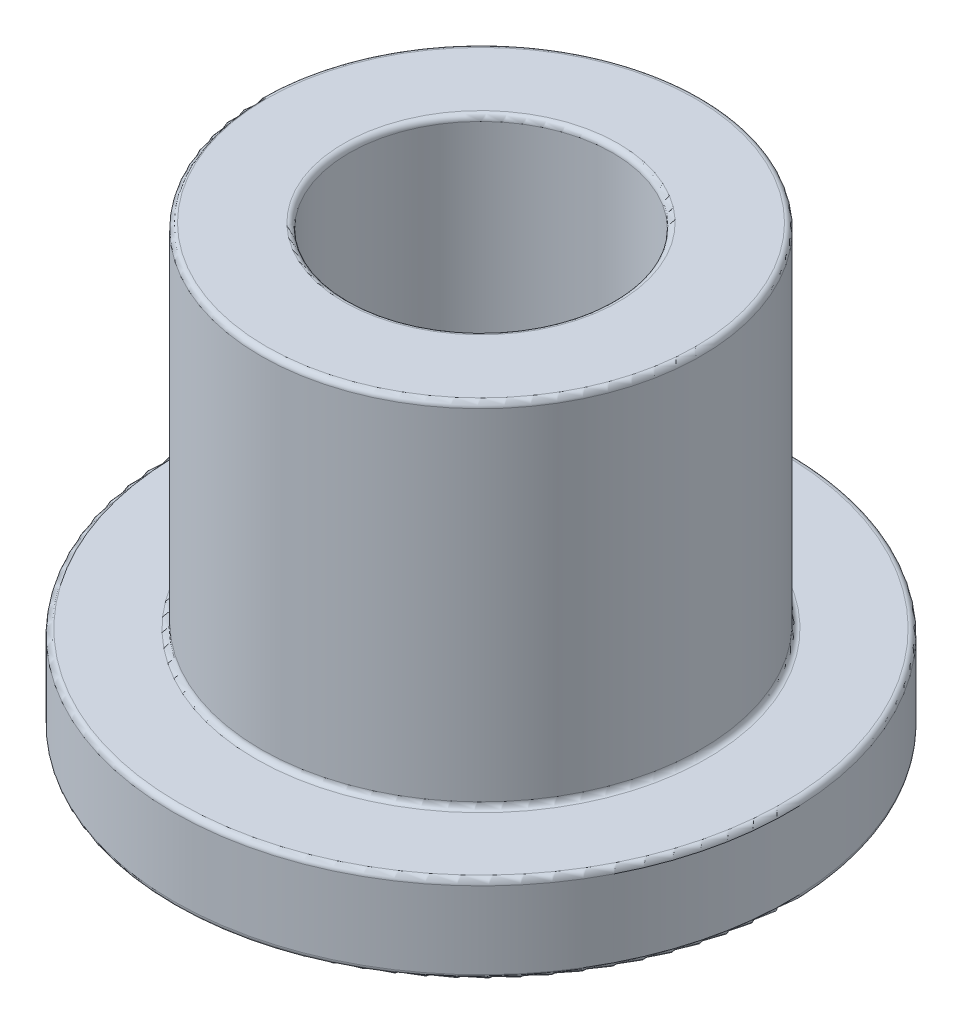
ISO-10303-21;
HEADER;
FILE_DESCRIPTION(('STEP AP214'),'2;1');
FILE_NAME('part.step','',(''),(''),'','','');
FILE_SCHEMA(('AUTOMOTIVE_DESIGN { 1 0 10303 214 1 1 1 1 }'));
ENDSEC;
DATA;
#1=APPLICATION_CONTEXT('core data for automotive mechanical design processes');
#2=APPLICATION_PROTOCOL_DEFINITION('international standard','automotive_design',2000,#1);
#3=PRODUCT_CONTEXT('',#1,'mechanical');
#4=PRODUCT('Part','Part','',(#3));
#5=PRODUCT_RELATED_PRODUCT_CATEGORY('part','',(#4));
#6=PRODUCT_DEFINITION_FORMATION('','',#4);
#7=PRODUCT_DEFINITION_CONTEXT('part definition',#1,'design');
#8=PRODUCT_DEFINITION('design','',#6,#7);
#9=PRODUCT_DEFINITION_SHAPE('','',#8);
#10=(LENGTH_UNIT() NAMED_UNIT(*) SI_UNIT(.MILLI.,.METRE.));
#11=(NAMED_UNIT(*) PLANE_ANGLE_UNIT() SI_UNIT($,.RADIAN.));
#12=(NAMED_UNIT(*) SI_UNIT($,.STERADIAN.) SOLID_ANGLE_UNIT());
#13=UNCERTAINTY_MEASURE_WITH_UNIT(LENGTH_MEASURE(1.E-05),#10,'distance_accuracy_value','');
#14=(GEOMETRIC_REPRESENTATION_CONTEXT(3) GLOBAL_UNCERTAINTY_ASSIGNED_CONTEXT((#13)) GLOBAL_UNIT_ASSIGNED_CONTEXT((#10,
#11,#12)) REPRESENTATION_CONTEXT('',''));
#15=CARTESIAN_POINT('',(0.,0.,0.));
#16=DIRECTION('',(0.,0.,1.));
#17=DIRECTION('',(1.,0.,0.));
#18=AXIS2_PLACEMENT_3D('',#15,#16,#17);
#19=CARTESIAN_POINT('',(0.,10.,0.));
#20=DIRECTION('',(0.,1.,0.));
#21=DIRECTION('',(0.,0.,1.));
#22=AXIS2_PLACEMENT_3D('',#19,#20,#21);
#23=PLANE('',#22);
#24=CARTESIAN_POINT('',(0.,10.,0.));
#25=DIRECTION('',(0.,1.,0.));
#26=DIRECTION('',(0.,0.,1.));
#27=AXIS2_PLACEMENT_3D('',#24,#25,#26);
#28=CIRCLE('',#27,3.125);
#29=CARTESIAN_POINT('',(0.,10.,3.125));
#30=VERTEX_POINT('',#29);
#31=EDGE_CURVE('E10',#30,#30,#28,.F.);
#32=ORIENTED_EDGE('',*,*,#31,.T.);
#33=EDGE_LOOP('',(#32));
#34=FACE_BOUND('',#33,.T.);
#35=CARTESIAN_POINT('',(0.,10.,0.));
#36=DIRECTION('',(0.,1.,0.));
#37=DIRECTION('',(0.,0.,1.));
#38=AXIS2_PLACEMENT_3D('',#35,#36,#37);
#39=CIRCLE('',#38,4.885);
#40=CARTESIAN_POINT('',(0.,10.,4.885));
#41=VERTEX_POINT('',#40);
#42=EDGE_CURVE('E46',#41,#41,#39,.T.);
#43=ORIENTED_EDGE('',*,*,#42,.T.);
#44=EDGE_LOOP('',(#43));
#45=FACE_BOUND('',#44,.T.);
#46=ADVANCED_FACE('F39',(#34,#45),#23,.T.);
#47=CARTESIAN_POINT('',(0.,0.,0.));
#48=DIRECTION('',(0.,1.,0.));
#49=DIRECTION('',(0.,0.,1.));
#50=AXIS2_PLACEMENT_3D('',#47,#48,#49);
#51=PLANE('',#50);
#52=CARTESIAN_POINT('',(0.,0.,0.));
#53=DIRECTION('',(0.,1.,0.));
#54=DIRECTION('',(0.,0.,1.));
#55=AXIS2_PLACEMENT_3D('',#52,#53,#54);
#56=CIRCLE('',#55,3.125);
#57=CARTESIAN_POINT('',(0.,0.,3.125));
#58=VERTEX_POINT('',#57);
#59=EDGE_CURVE('E77',#58,#58,#56,.T.);
#60=ORIENTED_EDGE('',*,*,#59,.T.);
#61=EDGE_LOOP('',(#60));
#62=FACE_BOUND('',#61,.T.);
#63=CARTESIAN_POINT('',(0.,0.,0.));
#64=DIRECTION('',(0.,1.,0.));
#65=DIRECTION('',(0.,0.,1.));
#66=AXIS2_PLACEMENT_3D('',#63,#64,#65);
#67=CIRCLE('',#66,6.875);
#68=CARTESIAN_POINT('',(0.,0.,6.875));
#69=VERTEX_POINT('',#68);
#70=EDGE_CURVE('E80',#69,#69,#67,.F.);
#71=ORIENTED_EDGE('',*,*,#70,.T.);
#72=EDGE_LOOP('',(#71));
#73=FACE_BOUND('',#72,.T.);
#74=ADVANCED_FACE('F84',(#62,#73),#51,.F.);
#75=CARTESIAN_POINT('',(0.,10.,0.));
#76=DIRECTION('',(0.,-1.,0.));
#77=DIRECTION('',(0.,0.,-1.));
#78=AXIS2_PLACEMENT_3D('',#75,#76,#77);
#79=CYLINDRICAL_SURFACE('',#78,5.01);
#80=CARTESIAN_POINT('',(0.,2.125,0.));
#81=DIRECTION('',(0.,1.,0.));
#82=DIRECTION('',(0.,0.,1.));
#83=AXIS2_PLACEMENT_3D('',#80,#81,#82);
#84=CIRCLE('',#83,5.01);
#85=CARTESIAN_POINT('',(0.,2.125,5.01));
#86=VERTEX_POINT('',#85);
#87=EDGE_CURVE('E59',#86,#86,#84,.T.);
#88=ORIENTED_EDGE('',*,*,#87,.T.);
#89=EDGE_LOOP('',(#88));
#90=FACE_BOUND('',#89,.T.);
#91=CARTESIAN_POINT('',(0.,9.875,0.));
#92=DIRECTION('',(0.,1.,0.));
#93=DIRECTION('',(0.,0.,1.));
#94=AXIS2_PLACEMENT_3D('',#91,#92,#93);
#95=CIRCLE('',#94,5.01);
#96=CARTESIAN_POINT('',(0.,9.875,5.01));
#97=VERTEX_POINT('',#96);
#98=EDGE_CURVE('E62',#97,#97,#95,.F.);
#99=ORIENTED_EDGE('',*,*,#98,.T.);
#100=EDGE_LOOP('',(#99));
#101=FACE_BOUND('',#100,.T.);
#102=ADVANCED_FACE('F115',(#90,#101),#79,.T.);
#103=CARTESIAN_POINT('',(0.,10.,0.));
#104=DIRECTION('',(0.,-1.,0.));
#105=DIRECTION('',(0.,0.,-1.));
#106=AXIS2_PLACEMENT_3D('',#103,#104,#105);
#107=CYLINDRICAL_SURFACE('',#106,3.);
#108=CARTESIAN_POINT('',(0.,0.125,0.));
#109=DIRECTION('',(0.,1.,0.));
#110=DIRECTION('',(0.,0.,1.));
#111=AXIS2_PLACEMENT_3D('',#108,#109,#110);
#112=CIRCLE('',#111,3.);
#113=CARTESIAN_POINT('',(0.,0.125,3.));
#114=VERTEX_POINT('',#113);
#115=EDGE_CURVE('E71',#114,#114,#112,.F.);
#116=ORIENTED_EDGE('',*,*,#115,.T.);
#117=EDGE_LOOP('',(#116));
#118=FACE_BOUND('',#117,.T.);
#119=CARTESIAN_POINT('',(0.,9.875,0.));
#120=DIRECTION('',(0.,1.,0.));
#121=DIRECTION('',(0.,0.,1.));
#122=AXIS2_PLACEMENT_3D('',#119,#120,#121);
#123=CIRCLE('',#122,3.);
#124=CARTESIAN_POINT('',(0.,9.875,3.));
#125=VERTEX_POINT('',#124);
#126=EDGE_CURVE('E74',#125,#125,#123,.T.);
#127=ORIENTED_EDGE('',*,*,#126,.T.);
#128=EDGE_LOOP('',(#127));
#129=FACE_BOUND('',#128,.T.);
#130=ADVANCED_FACE('F109',(#118,#129),#107,.F.);
#131=CARTESIAN_POINT('',(0.,2.,0.));
#132=DIRECTION('',(0.,1.,0.));
#133=DIRECTION('',(0.,0.,1.));
#134=AXIS2_PLACEMENT_3D('',#131,#132,#133);
#135=PLANE('',#134);
#136=CARTESIAN_POINT('',(0.,2.,0.));
#137=DIRECTION('',(0.,1.,0.));
#138=DIRECTION('',(0.,0.,1.));
#139=AXIS2_PLACEMENT_3D('',#136,#137,#138);
#140=CIRCLE('',#139,5.135);
#141=CARTESIAN_POINT('',(0.,2.,5.135));
#142=VERTEX_POINT('',#141);
#143=EDGE_CURVE('E50',#142,#142,#140,.F.);
#144=ORIENTED_EDGE('',*,*,#143,.T.);
#145=EDGE_LOOP('',(#144));
#146=FACE_BOUND('',#145,.T.);
#147=CARTESIAN_POINT('',(0.,2.,0.));
#148=DIRECTION('',(0.,1.,0.));
#149=DIRECTION('',(0.,0.,1.));
#150=AXIS2_PLACEMENT_3D('',#147,#148,#149);
#151=CIRCLE('',#150,6.875);
#152=CARTESIAN_POINT('',(0.,2.,6.875));
#153=VERTEX_POINT('',#152);
#154=EDGE_CURVE('E54',#153,#153,#151,.T.);
#155=ORIENTED_EDGE('',*,*,#154,.T.);
#156=EDGE_LOOP('',(#155));
#157=FACE_BOUND('',#156,.T.);
#158=ADVANCED_FACE('F97',(#146,#157),#135,.T.);
#159=CARTESIAN_POINT('',(0.,2.,0.));
#160=DIRECTION('',(0.,-1.,0.));
#161=DIRECTION('',(0.,0.,-1.));
#162=AXIS2_PLACEMENT_3D('',#159,#160,#161);
#163=CYLINDRICAL_SURFACE('',#162,7.);
#164=CARTESIAN_POINT('',(0.,0.125,0.));
#165=DIRECTION('',(0.,1.,0.));
#166=DIRECTION('',(0.,0.,1.));
#167=AXIS2_PLACEMENT_3D('',#164,#165,#166);
#168=CIRCLE('',#167,7.);
#169=CARTESIAN_POINT('',(0.,0.125,7.));
#170=VERTEX_POINT('',#169);
#171=EDGE_CURVE('E65',#170,#170,#168,.T.);
#172=ORIENTED_EDGE('',*,*,#171,.T.);
#173=EDGE_LOOP('',(#172));
#174=FACE_BOUND('',#173,.T.);
#175=CARTESIAN_POINT('',(0.,1.875,0.));
#176=DIRECTION('',(0.,1.,0.));
#177=DIRECTION('',(0.,0.,1.));
#178=AXIS2_PLACEMENT_3D('',#175,#176,#177);
#179=CIRCLE('',#178,7.);
#180=CARTESIAN_POINT('',(0.,1.875,7.));
#181=VERTEX_POINT('',#180);
#182=EDGE_CURVE('E68',#181,#181,#179,.F.);
#183=ORIENTED_EDGE('',*,*,#182,.T.);
#184=EDGE_LOOP('',(#183));
#185=FACE_BOUND('',#184,.T.);
#186=ADVANCED_FACE('F94',(#174,#185),#163,.T.);
#187=CARTESIAN_POINT('',(0.,0.125,0.));
#188=DIRECTION('',(0.,1.,0.));
#189=DIRECTION('',(0.,0.,1.));
#190=AXIS2_PLACEMENT_3D('',#187,#188,#189);
#191=TOROIDAL_SURFACE('',#190,3.125,0.125);
#192=ORIENTED_EDGE('',*,*,#115,.F.);
#193=EDGE_LOOP('',(#192));
#194=FACE_BOUND('',#193,.T.);
#195=ORIENTED_EDGE('',*,*,#59,.F.);
#196=EDGE_LOOP('',(#195));
#197=FACE_BOUND('',#196,.T.);
#198=ADVANCED_FACE('F90',(#194,#197),#191,.T.);
#199=CARTESIAN_POINT('',(0.,0.125,0.));
#200=DIRECTION('',(0.,1.,0.));
#201=DIRECTION('',(0.,0.,1.));
#202=AXIS2_PLACEMENT_3D('',#199,#200,#201);
#203=TOROIDAL_SURFACE('',#202,6.875,0.125);
#204=ORIENTED_EDGE('',*,*,#70,.F.);
#205=EDGE_LOOP('',(#204));
#206=FACE_BOUND('',#205,.T.);
#207=ORIENTED_EDGE('',*,*,#171,.F.);
#208=EDGE_LOOP('',(#207));
#209=FACE_BOUND('',#208,.T.);
#210=ADVANCED_FACE('F86',(#206,#209),#203,.T.);
#211=CARTESIAN_POINT('',(0.,2.125,0.));
#212=DIRECTION('',(0.,1.,0.));
#213=DIRECTION('',(0.,0.,1.));
#214=AXIS2_PLACEMENT_3D('',#211,#212,#213);
#215=TOROIDAL_SURFACE('',#214,5.135,0.125);
#216=ORIENTED_EDGE('',*,*,#143,.F.);
#217=EDGE_LOOP('',(#216));
#218=FACE_BOUND('',#217,.T.);
#219=ORIENTED_EDGE('',*,*,#87,.F.);
#220=EDGE_LOOP('',(#219));
#221=FACE_BOUND('',#220,.T.);
#222=ADVANCED_FACE('F89',(#218,#221),#215,.F.);
#223=CARTESIAN_POINT('',(0.,1.875,0.));
#224=DIRECTION('',(0.,1.,0.));
#225=DIRECTION('',(0.,0.,1.));
#226=AXIS2_PLACEMENT_3D('',#223,#224,#225);
#227=TOROIDAL_SURFACE('',#226,6.875,0.125);
#228=ORIENTED_EDGE('',*,*,#182,.F.);
#229=EDGE_LOOP('',(#228));
#230=FACE_BOUND('',#229,.T.);
#231=ORIENTED_EDGE('',*,*,#154,.F.);
#232=EDGE_LOOP('',(#231));
#233=FACE_BOUND('',#232,.T.);
#234=ADVANCED_FACE('F101',(#230,#233),#227,.T.);
#235=CARTESIAN_POINT('',(0.,9.875,0.));
#236=DIRECTION('',(0.,1.,0.));
#237=DIRECTION('',(0.,0.,1.));
#238=AXIS2_PLACEMENT_3D('',#235,#236,#237);
#239=TOROIDAL_SURFACE('',#238,3.125,0.125);
#240=ORIENTED_EDGE('',*,*,#31,.F.);
#241=EDGE_LOOP('',(#240));
#242=FACE_BOUND('',#241,.T.);
#243=ORIENTED_EDGE('',*,*,#126,.F.);
#244=EDGE_LOOP('',(#243));
#245=FACE_BOUND('',#244,.T.);
#246=ADVANCED_FACE('F104',(#242,#245),#239,.T.);
#247=CARTESIAN_POINT('',(0.,9.875,0.));
#248=DIRECTION('',(0.,1.,0.));
#249=DIRECTION('',(0.,0.,1.));
#250=AXIS2_PLACEMENT_3D('',#247,#248,#249);
#251=TOROIDAL_SURFACE('',#250,4.885,0.125);
#252=ORIENTED_EDGE('',*,*,#98,.F.);
#253=EDGE_LOOP('',(#252));
#254=FACE_BOUND('',#253,.T.);
#255=ORIENTED_EDGE('',*,*,#42,.F.);
#256=EDGE_LOOP('',(#255));
#257=FACE_BOUND('',#256,.T.);
#258=ADVANCED_FACE('F41',(#254,#257),#251,.T.);
#259=CLOSED_SHELL('',(#46,#74,#102,#130,#158,#186,#198,#210,#222,#234,#246,#258));
#260=MANIFOLD_SOLID_BREP('B2',#259);
#261=ADVANCED_BREP_SHAPE_REPRESENTATION('',(#18,#260),#14);
#262=SHAPE_DEFINITION_REPRESENTATION(#9,#261);
ENDSEC;
END-ISO-10303-21;
